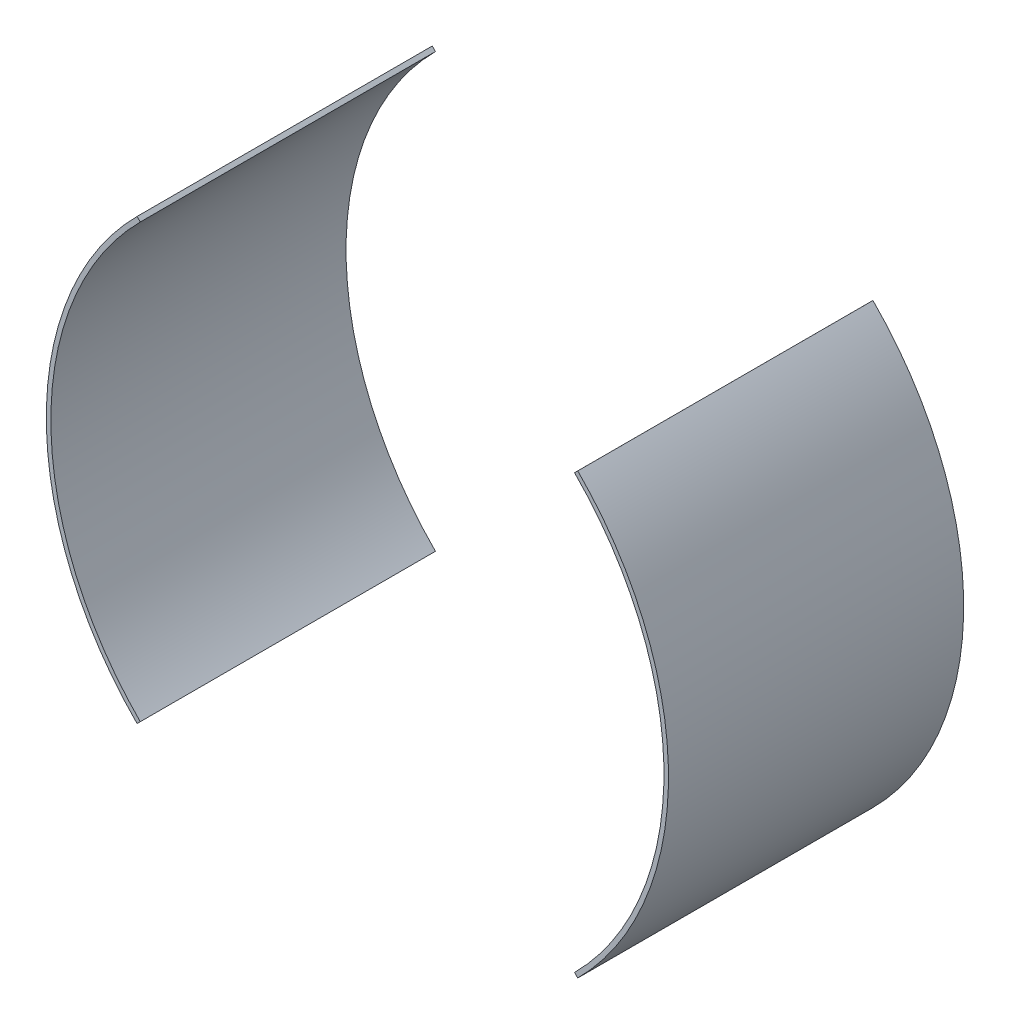
ISO-10303-21;
HEADER;
FILE_DESCRIPTION(('STEP AP214'),'2;1');
FILE_NAME('part.step','',(''),(''),'','','');
FILE_SCHEMA(('AUTOMOTIVE_DESIGN { 1 0 10303 214 1 1 1 1 }'));
ENDSEC;
DATA;
#1=APPLICATION_CONTEXT('core data for automotive mechanical design processes');
#2=APPLICATION_PROTOCOL_DEFINITION('international standard','automotive_design',2000,#1);
#3=PRODUCT_CONTEXT('',#1,'mechanical');
#4=PRODUCT('Part','Part','',(#3));
#5=PRODUCT_RELATED_PRODUCT_CATEGORY('part','',(#4));
#6=PRODUCT_DEFINITION_FORMATION('','',#4);
#7=PRODUCT_DEFINITION_CONTEXT('part definition',#1,'design');
#8=PRODUCT_DEFINITION('design','',#6,#7);
#9=PRODUCT_DEFINITION_SHAPE('','',#8);
#10=(LENGTH_UNIT() NAMED_UNIT(*) SI_UNIT(.MILLI.,.METRE.));
#11=(NAMED_UNIT(*) PLANE_ANGLE_UNIT() SI_UNIT($,.RADIAN.));
#12=(NAMED_UNIT(*) SI_UNIT($,.STERADIAN.) SOLID_ANGLE_UNIT());
#13=UNCERTAINTY_MEASURE_WITH_UNIT(LENGTH_MEASURE(1.E-05),#10,'distance_accuracy_value','');
#14=(GEOMETRIC_REPRESENTATION_CONTEXT(3) GLOBAL_UNCERTAINTY_ASSIGNED_CONTEXT((#13)) GLOBAL_UNIT_ASSIGNED_CONTEXT((#10,
#11,#12)) REPRESENTATION_CONTEXT('',''));
#15=CARTESIAN_POINT('',(0.,0.,0.));
#16=DIRECTION('',(0.,0.,1.));
#17=DIRECTION('',(1.,0.,0.));
#18=AXIS2_PLACEMENT_3D('',#15,#16,#17);
#19=CARTESIAN_POINT('',(0.,0.,165.1));
#20=DIRECTION('',(0.,0.,-1.));
#21=DIRECTION('',(-1.,0.,0.));
#22=AXIS2_PLACEMENT_3D('',#19,#20,#21);
#23=CYLINDRICAL_SURFACE('',#22,173.99);
#24=CARTESIAN_POINT('',(0.,0.,0.));
#25=DIRECTION('',(0.,0.,1.));
#26=DIRECTION('',(1.,0.,0.));
#27=AXIS2_PLACEMENT_3D('',#24,#25,#26);
#28=CIRCLE('',#27,173.99);
#29=CARTESIAN_POINT('',(123.242178868475,-122.816470588235,0.));
#30=VERTEX_POINT('',#29);
#31=CARTESIAN_POINT('',(123.242178868475,122.816470588235,0.));
#32=VERTEX_POINT('',#31);
#33=EDGE_CURVE('E110',#30,#32,#28,.T.);
#34=ORIENTED_EDGE('',*,*,#33,.T.);
#35=DIRECTION('',(0.,0.,-1.));
#36=VECTOR('',#35,1.);
#37=CARTESIAN_POINT('',(123.242178868475,122.816470588235,165.1));
#38=LINE('',#37,#36);
#39=CARTESIAN_POINT('',(123.242178868475,122.816470588235,165.1));
#40=VERTEX_POINT('',#39);
#41=EDGE_CURVE('E12',#40,#32,#38,.T.);
#42=ORIENTED_EDGE('',*,*,#41,.F.);
#43=CARTESIAN_POINT('',(0.,0.,165.1));
#44=DIRECTION('',(0.,0.,1.));
#45=DIRECTION('',(1.,0.,0.));
#46=AXIS2_PLACEMENT_3D('',#43,#44,#45);
#47=CIRCLE('',#46,173.99);
#48=CARTESIAN_POINT('',(123.242178868475,-122.816470588235,165.1));
#49=VERTEX_POINT('',#48);
#50=EDGE_CURVE('E87',#49,#40,#47,.T.);
#51=ORIENTED_EDGE('',*,*,#50,.F.);
#52=DIRECTION('',(0.,0.,-1.));
#53=VECTOR('',#52,1.);
#54=CARTESIAN_POINT('',(123.242178868475,-122.816470588235,165.1));
#55=LINE('',#54,#53);
#56=EDGE_CURVE('E63',#49,#30,#55,.T.);
#57=ORIENTED_EDGE('',*,*,#56,.T.);
#58=EDGE_LOOP('',(#34,#42,#51,#57));
#59=FACE_BOUND('',#58,.T.);
#60=ADVANCED_FACE('F47',(#59),#23,.T.);
#61=CARTESIAN_POINT('',(121.443022972585,121.023529411765,165.1));
#62=DIRECTION('',(-0.705882352941176,0.708329092870135,0.));
#63=DIRECTION('',(-0.708329092870135,-0.705882352941176,0.));
#64=AXIS2_PLACEMENT_3D('',#61,#62,#63);
#65=PLANE('',#64);
#66=DIRECTION('',(0.708329092870135,0.705882352941176,0.));
#67=VECTOR('',#66,1.);
#68=CARTESIAN_POINT('',(121.443022972585,121.023529411765,0.));
#69=LINE('',#68,#67);
#70=CARTESIAN_POINT('',(121.443022972585,121.023529411765,0.));
#71=VERTEX_POINT('',#70);
#72=EDGE_CURVE('E96',#71,#32,#69,.T.);
#73=ORIENTED_EDGE('',*,*,#72,.F.);
#74=DIRECTION('',(0.,0.,-1.));
#75=VECTOR('',#74,1.);
#76=CARTESIAN_POINT('',(121.443022972585,121.023529411765,165.1));
#77=LINE('',#76,#75);
#78=CARTESIAN_POINT('',(121.443022972585,121.023529411765,165.1));
#79=VERTEX_POINT('',#78);
#80=EDGE_CURVE('E55',#79,#71,#77,.T.);
#81=ORIENTED_EDGE('',*,*,#80,.F.);
#82=DIRECTION('',(0.708329092870135,0.705882352941176,0.));
#83=VECTOR('',#82,1.);
#84=CARTESIAN_POINT('',(121.443022972585,121.023529411765,165.1));
#85=LINE('',#84,#83);
#86=EDGE_CURVE('E94',#79,#40,#85,.T.);
#87=ORIENTED_EDGE('',*,*,#86,.T.);
#88=ORIENTED_EDGE('',*,*,#41,.T.);
#89=EDGE_LOOP('',(#73,#81,#87,#88));
#90=FACE_BOUND('',#89,.T.);
#91=ADVANCED_FACE('F93',(#90),#65,.T.);
#92=CARTESIAN_POINT('',(0.,0.,165.1));
#93=DIRECTION('',(0.,0.,-1.));
#94=DIRECTION('',(-1.,0.,0.));
#95=AXIS2_PLACEMENT_3D('',#92,#93,#94);
#96=CYLINDRICAL_SURFACE('',#95,171.45);
#97=CARTESIAN_POINT('',(0.,0.,0.));
#98=DIRECTION('',(0.,0.,1.));
#99=DIRECTION('',(1.,0.,0.));
#100=AXIS2_PLACEMENT_3D('',#97,#98,#99);
#101=CIRCLE('',#100,171.45);
#102=CARTESIAN_POINT('',(121.443022972585,-121.023529411765,0.));
#103=VERTEX_POINT('',#102);
#104=EDGE_CURVE('E113',#103,#71,#101,.T.);
#105=ORIENTED_EDGE('',*,*,#104,.F.);
#106=DIRECTION('',(0.,0.,-1.));
#107=VECTOR('',#106,1.);
#108=CARTESIAN_POINT('',(121.443022972585,-121.023529411765,165.1));
#109=LINE('',#108,#107);
#110=CARTESIAN_POINT('',(121.443022972585,-121.023529411765,165.1));
#111=VERTEX_POINT('',#110);
#112=EDGE_CURVE('E76',#111,#103,#109,.T.);
#113=ORIENTED_EDGE('',*,*,#112,.F.);
#114=CARTESIAN_POINT('',(0.,0.,165.1));
#115=DIRECTION('',(0.,0.,1.));
#116=DIRECTION('',(1.,0.,0.));
#117=AXIS2_PLACEMENT_3D('',#114,#115,#116);
#118=CIRCLE('',#117,171.45);
#119=EDGE_CURVE('E102',#111,#79,#118,.T.);
#120=ORIENTED_EDGE('',*,*,#119,.T.);
#121=ORIENTED_EDGE('',*,*,#80,.T.);
#122=EDGE_LOOP('',(#105,#113,#120,#121));
#123=FACE_BOUND('',#122,.T.);
#124=ADVANCED_FACE('F104',(#123),#96,.F.);
#125=CARTESIAN_POINT('',(123.242178868475,-122.816470588235,165.1));
#126=DIRECTION('',(-0.705882352941176,-0.708329092870135,0.));
#127=DIRECTION('',(0.708329092870135,-0.705882352941176,0.));
#128=AXIS2_PLACEMENT_3D('',#125,#126,#127);
#129=PLANE('',#128);
#130=DIRECTION('',(-0.708329092870135,0.705882352941176,0.));
#131=VECTOR('',#130,1.);
#132=CARTESIAN_POINT('',(123.242178868475,-122.816470588235,0.));
#133=LINE('',#132,#131);
#134=EDGE_CURVE('E115',#30,#103,#133,.T.);
#135=ORIENTED_EDGE('',*,*,#134,.F.);
#136=ORIENTED_EDGE('',*,*,#56,.F.);
#137=DIRECTION('',(-0.708329092870135,0.705882352941176,0.));
#138=VECTOR('',#137,1.);
#139=CARTESIAN_POINT('',(123.242178868475,-122.816470588235,165.1));
#140=LINE('',#139,#138);
#141=EDGE_CURVE('E105',#49,#111,#140,.T.);
#142=ORIENTED_EDGE('',*,*,#141,.T.);
#143=ORIENTED_EDGE('',*,*,#112,.T.);
#144=EDGE_LOOP('',(#135,#136,#142,#143));
#145=FACE_BOUND('',#144,.T.);
#146=ADVANCED_FACE('F121',(#145),#129,.T.);
#147=CARTESIAN_POINT('',(0.,0.,165.1));
#148=DIRECTION('',(0.,0.,1.));
#149=DIRECTION('',(1.,0.,0.));
#150=AXIS2_PLACEMENT_3D('',#147,#148,#149);
#151=PLANE('',#150);
#152=ORIENTED_EDGE('',*,*,#50,.T.);
#153=ORIENTED_EDGE('',*,*,#86,.F.);
#154=ORIENTED_EDGE('',*,*,#119,.F.);
#155=ORIENTED_EDGE('',*,*,#141,.F.);
#156=EDGE_LOOP('',(#152,#153,#154,#155));
#157=FACE_BOUND('',#156,.T.);
#158=ADVANCED_FACE('F101',(#157),#151,.T.);
#159=CARTESIAN_POINT('',(0.,0.,0.));
#160=DIRECTION('',(0.,0.,1.));
#161=DIRECTION('',(1.,0.,0.));
#162=AXIS2_PLACEMENT_3D('',#159,#160,#161);
#163=PLANE('',#162);
#164=ORIENTED_EDGE('',*,*,#33,.F.);
#165=ORIENTED_EDGE('',*,*,#134,.T.);
#166=ORIENTED_EDGE('',*,*,#104,.T.);
#167=ORIENTED_EDGE('',*,*,#72,.T.);
#168=EDGE_LOOP('',(#164,#165,#166,#167));
#169=FACE_BOUND('',#168,.T.);
#170=ADVANCED_FACE('F120',(#169),#163,.F.);
#171=CLOSED_SHELL('',(#60,#91,#124,#146,#158,#170));
#172=MANIFOLD_SOLID_BREP('B2',#171);
#173=CARTESIAN_POINT('',(0.,0.,165.1));
#174=DIRECTION('',(0.,0.,-1.));
#175=DIRECTION('',(-1.,0.,0.));
#176=AXIS2_PLACEMENT_3D('',#173,#174,#175);
#177=CYLINDRICAL_SURFACE('',#176,173.99);
#178=CARTESIAN_POINT('',(0.,0.,0.));
#179=DIRECTION('',(0.,0.,1.));
#180=DIRECTION('',(1.,0.,0.));
#181=AXIS2_PLACEMENT_3D('',#178,#179,#180);
#182=CIRCLE('',#181,173.99);
#183=CARTESIAN_POINT('',(-123.242178868475,122.816470588235,0.));
#184=VERTEX_POINT('',#183);
#185=CARTESIAN_POINT('',(-123.242178868475,-122.816470588235,0.));
#186=VERTEX_POINT('',#185);
#187=EDGE_CURVE('E236',#184,#186,#182,.T.);
#188=ORIENTED_EDGE('',*,*,#187,.T.);
#189=DIRECTION('',(0.,0.,-1.));
#190=VECTOR('',#189,1.);
#191=CARTESIAN_POINT('',(-123.242178868475,-122.816470588235,165.1));
#192=LINE('',#191,#190);
#193=CARTESIAN_POINT('',(-123.242178868475,-122.816470588235,165.1));
#194=VERTEX_POINT('',#193);
#195=EDGE_CURVE('E45',#194,#186,#192,.T.);
#196=ORIENTED_EDGE('',*,*,#195,.F.);
#197=CARTESIAN_POINT('',(0.,0.,165.1));
#198=DIRECTION('',(0.,0.,1.));
#199=DIRECTION('',(1.,0.,0.));
#200=AXIS2_PLACEMENT_3D('',#197,#198,#199);
#201=CIRCLE('',#200,173.99);
#202=CARTESIAN_POINT('',(-123.242178868475,122.816470588235,165.1));
#203=VERTEX_POINT('',#202);
#204=EDGE_CURVE('E213',#203,#194,#201,.T.);
#205=ORIENTED_EDGE('',*,*,#204,.F.);
#206=DIRECTION('',(0.,0.,-1.));
#207=VECTOR('',#206,1.);
#208=CARTESIAN_POINT('',(-123.242178868475,122.816470588235,165.1));
#209=LINE('',#208,#207);
#210=EDGE_CURVE('E189',#203,#184,#209,.T.);
#211=ORIENTED_EDGE('',*,*,#210,.T.);
#212=EDGE_LOOP('',(#188,#196,#205,#211));
#213=FACE_BOUND('',#212,.T.);
#214=ADVANCED_FACE('F173',(#213),#177,.T.);
#215=CARTESIAN_POINT('',(-121.443022972585,-121.023529411765,165.1));
#216=DIRECTION('',(0.705882352941174,-0.708329092870138,0.));
#217=DIRECTION('',(0.708329092870138,0.705882352941174,0.));
#218=AXIS2_PLACEMENT_3D('',#215,#216,#217);
#219=PLANE('',#218);
#220=DIRECTION('',(-0.708329092870138,-0.705882352941174,0.));
#221=VECTOR('',#220,1.);
#222=CARTESIAN_POINT('',(-121.443022972585,-121.023529411765,0.));
#223=LINE('',#222,#221);
#224=CARTESIAN_POINT('',(-121.443022972585,-121.023529411765,0.));
#225=VERTEX_POINT('',#224);
#226=EDGE_CURVE('E222',#225,#186,#223,.T.);
#227=ORIENTED_EDGE('',*,*,#226,.F.);
#228=DIRECTION('',(0.,0.,-1.));
#229=VECTOR('',#228,1.);
#230=CARTESIAN_POINT('',(-121.443022972585,-121.023529411765,165.1));
#231=LINE('',#230,#229);
#232=CARTESIAN_POINT('',(-121.443022972585,-121.023529411765,165.1));
#233=VERTEX_POINT('',#232);
#234=EDGE_CURVE('E181',#233,#225,#231,.T.);
#235=ORIENTED_EDGE('',*,*,#234,.F.);
#236=DIRECTION('',(-0.708329092870138,-0.705882352941174,0.));
#237=VECTOR('',#236,1.);
#238=CARTESIAN_POINT('',(-121.443022972585,-121.023529411765,165.1));
#239=LINE('',#238,#237);
#240=EDGE_CURVE('E220',#233,#194,#239,.T.);
#241=ORIENTED_EDGE('',*,*,#240,.T.);
#242=ORIENTED_EDGE('',*,*,#195,.T.);
#243=EDGE_LOOP('',(#227,#235,#241,#242));
#244=FACE_BOUND('',#243,.T.);
#245=ADVANCED_FACE('F219',(#244),#219,.T.);
#246=CARTESIAN_POINT('',(0.,0.,165.1));
#247=DIRECTION('',(0.,0.,-1.));
#248=DIRECTION('',(-1.,0.,0.));
#249=AXIS2_PLACEMENT_3D('',#246,#247,#248);
#250=CYLINDRICAL_SURFACE('',#249,171.45);
#251=CARTESIAN_POINT('',(0.,0.,0.));
#252=DIRECTION('',(0.,0.,1.));
#253=DIRECTION('',(1.,0.,0.));
#254=AXIS2_PLACEMENT_3D('',#251,#252,#253);
#255=CIRCLE('',#254,171.45);
#256=CARTESIAN_POINT('',(-121.443022972585,121.023529411765,0.));
#257=VERTEX_POINT('',#256);
#258=EDGE_CURVE('E239',#257,#225,#255,.T.);
#259=ORIENTED_EDGE('',*,*,#258,.F.);
#260=DIRECTION('',(0.,0.,-1.));
#261=VECTOR('',#260,1.);
#262=CARTESIAN_POINT('',(-121.443022972585,121.023529411765,165.1));
#263=LINE('',#262,#261);
#264=CARTESIAN_POINT('',(-121.443022972585,121.023529411765,165.1));
#265=VERTEX_POINT('',#264);
#266=EDGE_CURVE('E202',#265,#257,#263,.T.);
#267=ORIENTED_EDGE('',*,*,#266,.F.);
#268=CARTESIAN_POINT('',(0.,0.,165.1));
#269=DIRECTION('',(0.,0.,1.));
#270=DIRECTION('',(1.,0.,0.));
#271=AXIS2_PLACEMENT_3D('',#268,#269,#270);
#272=CIRCLE('',#271,171.45);
#273=EDGE_CURVE('E228',#265,#233,#272,.T.);
#274=ORIENTED_EDGE('',*,*,#273,.T.);
#275=ORIENTED_EDGE('',*,*,#234,.T.);
#276=EDGE_LOOP('',(#259,#267,#274,#275));
#277=FACE_BOUND('',#276,.T.);
#278=ADVANCED_FACE('F230',(#277),#250,.F.);
#279=CARTESIAN_POINT('',(-123.242178868475,122.816470588235,165.1));
#280=DIRECTION('',(0.705882352941176,0.708329092870135,0.));
#281=DIRECTION('',(-0.708329092870135,0.705882352941176,0.));
#282=AXIS2_PLACEMENT_3D('',#279,#280,#281);
#283=PLANE('',#282);
#284=DIRECTION('',(0.708329092870135,-0.705882352941176,0.));
#285=VECTOR('',#284,1.);
#286=CARTESIAN_POINT('',(-123.242178868475,122.816470588235,0.));
#287=LINE('',#286,#285);
#288=EDGE_CURVE('E241',#184,#257,#287,.T.);
#289=ORIENTED_EDGE('',*,*,#288,.F.);
#290=ORIENTED_EDGE('',*,*,#210,.F.);
#291=DIRECTION('',(0.708329092870135,-0.705882352941176,0.));
#292=VECTOR('',#291,1.);
#293=CARTESIAN_POINT('',(-123.242178868475,122.816470588235,165.1));
#294=LINE('',#293,#292);
#295=EDGE_CURVE('E231',#203,#265,#294,.T.);
#296=ORIENTED_EDGE('',*,*,#295,.T.);
#297=ORIENTED_EDGE('',*,*,#266,.T.);
#298=EDGE_LOOP('',(#289,#290,#296,#297));
#299=FACE_BOUND('',#298,.T.);
#300=ADVANCED_FACE('F247',(#299),#283,.T.);
#301=CARTESIAN_POINT('',(0.,0.,165.1));
#302=DIRECTION('',(0.,0.,1.));
#303=DIRECTION('',(1.,0.,0.));
#304=AXIS2_PLACEMENT_3D('',#301,#302,#303);
#305=PLANE('',#304);
#306=ORIENTED_EDGE('',*,*,#204,.T.);
#307=ORIENTED_EDGE('',*,*,#240,.F.);
#308=ORIENTED_EDGE('',*,*,#273,.F.);
#309=ORIENTED_EDGE('',*,*,#295,.F.);
#310=EDGE_LOOP('',(#306,#307,#308,#309));
#311=FACE_BOUND('',#310,.T.);
#312=ADVANCED_FACE('F227',(#311),#305,.T.);
#313=CARTESIAN_POINT('',(0.,0.,0.));
#314=DIRECTION('',(0.,0.,1.));
#315=DIRECTION('',(1.,0.,0.));
#316=AXIS2_PLACEMENT_3D('',#313,#314,#315);
#317=PLANE('',#316);
#318=ORIENTED_EDGE('',*,*,#187,.F.);
#319=ORIENTED_EDGE('',*,*,#288,.T.);
#320=ORIENTED_EDGE('',*,*,#258,.T.);
#321=ORIENTED_EDGE('',*,*,#226,.T.);
#322=EDGE_LOOP('',(#318,#319,#320,#321));
#323=FACE_BOUND('',#322,.T.);
#324=ADVANCED_FACE('F246',(#323),#317,.F.);
#325=CLOSED_SHELL('',(#214,#245,#278,#300,#312,#324));
#326=MANIFOLD_SOLID_BREP('B6',#325);
#327=ADVANCED_BREP_SHAPE_REPRESENTATION('',(#18,#172,#326),#14);
#328=SHAPE_DEFINITION_REPRESENTATION(#9,#327);
ENDSEC;
END-ISO-10303-21;
